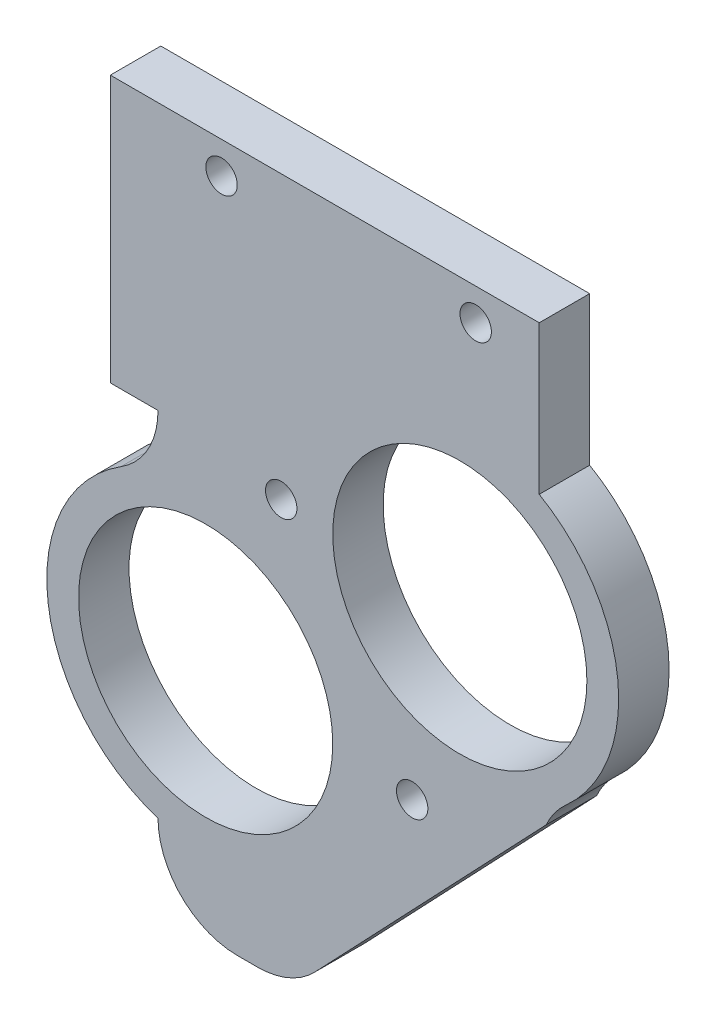
ISO-10303-21;
HEADER;
FILE_DESCRIPTION(('STEP AP214'),'2;1');
FILE_NAME('part.step','',(''),(''),'','','');
FILE_SCHEMA(('AUTOMOTIVE_DESIGN { 1 0 10303 214 1 1 1 1 }'));
ENDSEC;
DATA;
#1=APPLICATION_CONTEXT('core data for automotive mechanical design processes');
#2=APPLICATION_PROTOCOL_DEFINITION('international standard','automotive_design',2000,#1);
#3=PRODUCT_CONTEXT('',#1,'mechanical');
#4=PRODUCT('Part','Part','',(#3));
#5=PRODUCT_RELATED_PRODUCT_CATEGORY('part','',(#4));
#6=PRODUCT_DEFINITION_FORMATION('','',#4);
#7=PRODUCT_DEFINITION_CONTEXT('part definition',#1,'design');
#8=PRODUCT_DEFINITION('design','',#6,#7);
#9=PRODUCT_DEFINITION_SHAPE('','',#8);
#10=(LENGTH_UNIT() NAMED_UNIT(*) SI_UNIT(.MILLI.,.METRE.));
#11=(NAMED_UNIT(*) PLANE_ANGLE_UNIT() SI_UNIT($,.RADIAN.));
#12=(NAMED_UNIT(*) SI_UNIT($,.STERADIAN.) SOLID_ANGLE_UNIT());
#13=UNCERTAINTY_MEASURE_WITH_UNIT(LENGTH_MEASURE(1.E-05),#10,'distance_accuracy_value','');
#14=(GEOMETRIC_REPRESENTATION_CONTEXT(3) GLOBAL_UNCERTAINTY_ASSIGNED_CONTEXT((#13)) GLOBAL_UNIT_ASSIGNED_CONTEXT((#10,
#11,#12)) REPRESENTATION_CONTEXT('',''));
#15=CARTESIAN_POINT('',(0.,0.,0.));
#16=DIRECTION('',(0.,0.,1.));
#17=DIRECTION('',(1.,0.,0.));
#18=AXIS2_PLACEMENT_3D('',#15,#16,#17);
#19=CARTESIAN_POINT('',(29.9407204806582,31.5431624215841,6.35));
#20=DIRECTION('',(0.,0.,1.));
#21=DIRECTION('',(1.,0.,0.));
#22=AXIS2_PLACEMENT_3D('',#19,#20,#21);
#23=PLANE('',#22);
#24=CARTESIAN_POINT('',(-2.05927951934184,8.63316190959069,6.35));
#25=DIRECTION('',(0.,0.,1.));
#26=DIRECTION('',(1.,0.,0.));
#27=AXIS2_PLACEMENT_3D('',#24,#25,#26);
#28=CIRCLE('',#27,20.);
#29=CARTESIAN_POINT('',(-12.7259461860085,25.5512652968567,6.35));
#30=VERTEX_POINT('',#29);
#31=CARTESIAN_POINT('',(-8.05927951934187,-10.4456221187482,6.35));
#32=VERTEX_POINT('',#31);
#33=EDGE_CURVE('E169',#30,#32,#28,.T.);
#34=ORIENTED_EDGE('',*,*,#33,.T.);
#35=CARTESIAN_POINT('',(1.94070069324728,-10.4257287071368,6.35));
#36=DIRECTION('',(0.,0.,1.));
#37=DIRECTION('',(1.,0.,0.));
#38=AXIS2_PLACEMENT_3D('',#35,#36,#37);
#39=CIRCLE('',#38,10.);
#40=CARTESIAN_POINT('',(1.94070069324728,-20.4257287071368,6.35));
#41=VERTEX_POINT('',#40);
#42=EDGE_CURVE('E42',#32,#41,#39,.T.);
#43=ORIENTED_EDGE('',*,*,#42,.T.);
#44=DIRECTION('',(-1.,0.,0.));
#45=VECTOR('',#44,1.);
#46=CARTESIAN_POINT('',(-8.05927951934189,-20.4257287071368,6.35));
#47=LINE('',#46,#45);
#48=CARTESIAN_POINT('',(4.47625883225479,-20.4257287071368,6.35));
#49=VERTEX_POINT('',#48);
#50=EDGE_CURVE('E167',#49,#41,#47,.T.);
#51=ORIENTED_EDGE('',*,*,#50,.F.);
#52=CARTESIAN_POINT('',(4.47625883225479,-10.4257287071368,6.35));
#53=DIRECTION('',(0.,0.,1.));
#54=DIRECTION('',(1.,0.,0.));
#55=AXIS2_PLACEMENT_3D('',#52,#53,#54);
#56=CIRCLE('',#55,10.);
#57=CARTESIAN_POINT('',(11.7219358395692,-17.3177650321772,6.35000000000002));
#58=VERTEX_POINT('',#57);
#59=EDGE_CURVE('E49',#49,#58,#56,.T.);
#60=ORIENTED_EDGE('',*,*,#59,.T.);
#61=DIRECTION('',(0.689203632504033,0.72456770073144,0.));
#62=VECTOR('',#61,1.);
#63=CARTESIAN_POINT('',(40.8120111889054,13.2649655512249,6.35000000000002));
#64=LINE('',#63,#62);
#65=CARTESIAN_POINT('',(40.8120111889054,13.2649655512249,6.35000000000002));
#66=VERTEX_POINT('',#65);
#67=EDGE_CURVE('E121',#58,#66,#64,.T.);
#68=ORIENTED_EDGE('',*,*,#67,.T.);
#69=CARTESIAN_POINT('',(49.9407204806582,9.18248264658624,6.35));
#70=DIRECTION('',(0.,0.,1.));
#71=DIRECTION('',(1.,0.,0.));
#72=AXIS2_PLACEMENT_3D('',#69,#70,#71);
#73=CIRCLE('',#72,10.);
#74=CARTESIAN_POINT('',(43.2740538139915,16.6360425715855,6.35));
#75=VERTEX_POINT('',#74);
#76=EDGE_CURVE('E127',#66,#75,#73,.F.);
#77=ORIENTED_EDGE('',*,*,#76,.T.);
#78=CARTESIAN_POINT('',(29.9407204806582,31.5431624215841,6.35));
#79=DIRECTION('',(0.,0.,1.));
#80=DIRECTION('',(1.,0.,0.));
#81=AXIS2_PLACEMENT_3D('',#78,#79,#80);
#82=CIRCLE('',#81,20.);
#83=CARTESIAN_POINT('',(39.9407204806582,48.8636704972729,6.35));
#84=VERTEX_POINT('',#83);
#85=EDGE_CURVE('E201',#75,#84,#82,.T.);
#86=ORIENTED_EDGE('',*,*,#85,.T.);
#87=DIRECTION('',(0.,-1.,0.));
#88=VECTOR('',#87,1.);
#89=CARTESIAN_POINT('',(39.9407204806582,47.5742712928632,6.35));
#90=LINE('',#89,#88);
#91=CARTESIAN_POINT('',(39.9407204806582,67.5742712928632,6.35000000000002));
#92=VERTEX_POINT('',#91);
#93=EDGE_CURVE('E239',#92,#84,#90,.T.);
#94=ORIENTED_EDGE('',*,*,#93,.F.);
#95=DIRECTION('',(1.,0.,0.));
#96=VECTOR('',#95,1.);
#97=CARTESIAN_POINT('',(-8.05927951934186,67.5742712928632,6.35));
#98=LINE('',#97,#96);
#99=CARTESIAN_POINT('',(-14.0592795193419,67.5742712928632,6.35));
#100=VERTEX_POINT('',#99);
#101=EDGE_CURVE('E233',#100,#92,#98,.T.);
#102=ORIENTED_EDGE('',*,*,#101,.F.);
#103=DIRECTION('',(0.,1.,0.));
#104=VECTOR('',#103,1.);
#105=CARTESIAN_POINT('',(-14.0592795193419,67.5742712928632,6.35));
#106=LINE('',#105,#104);
#107=CARTESIAN_POINT('',(-14.0592795193419,34.0103169904897,6.35));
#108=VERTEX_POINT('',#107);
#109=EDGE_CURVE('E219',#108,#100,#106,.T.);
#110=ORIENTED_EDGE('',*,*,#109,.F.);
#111=DIRECTION('',(1.,0.,0.));
#112=VECTOR('',#111,1.);
#113=CARTESIAN_POINT('',(-14.0592795193419,34.0103169904897,6.35));
#114=LINE('',#113,#112);
#115=CARTESIAN_POINT('',(-8.05927951934186,34.0103169904897,6.35));
#116=VERTEX_POINT('',#115);
#117=EDGE_CURVE('E213',#108,#116,#114,.T.);
#118=ORIENTED_EDGE('',*,*,#117,.T.);
#119=CARTESIAN_POINT('',(-18.0592795193419,34.0103169904897,6.35));
#120=DIRECTION('',(0.,0.,1.));
#121=DIRECTION('',(1.,0.,0.));
#122=AXIS2_PLACEMENT_3D('',#119,#120,#121);
#123=CIRCLE('',#122,10.);
#124=EDGE_CURVE('E147',#116,#30,#123,.F.);
#125=ORIENTED_EDGE('',*,*,#124,.T.);
#126=EDGE_LOOP('',(#34,#43,#51,#60,#68,#77,#86,#94,#102,#110,#118,#125));
#127=FACE_BOUND('',#126,.T.);
#128=CARTESIAN_POINT('',(31.9407204806584,63.5742712928632,6.35));
#129=DIRECTION('',(0.,0.,1.));
#130=DIRECTION('',(1.,0.,0.));
#131=AXIS2_PLACEMENT_3D('',#128,#129,#130);
#132=CIRCLE('',#131,1.97631800523663);
#133=CARTESIAN_POINT('',(33.917038485895,63.5742712928632,6.35));
#134=VERTEX_POINT('',#133);
#135=EDGE_CURVE('E281',#134,#134,#132,.T.);
#136=ORIENTED_EDGE('',*,*,#135,.F.);
#137=EDGE_LOOP('',(#136));
#138=FACE_BOUND('',#137,.T.);
#139=CARTESIAN_POINT('',(7.45543910641975,32.0595526671018,6.35));
#140=DIRECTION('',(0.,0.,1.));
#141=DIRECTION('',(1.,0.,0.));
#142=AXIS2_PLACEMENT_3D('',#139,#140,#141);
#143=CIRCLE('',#142,1.97631800523663);
#144=CARTESIAN_POINT('',(9.43175711165638,32.0595526671018,6.35));
#145=VERTEX_POINT('',#144);
#146=EDGE_CURVE('E282',#145,#145,#143,.T.);
#147=ORIENTED_EDGE('',*,*,#146,.F.);
#148=EDGE_LOOP('',(#147));
#149=FACE_BOUND('',#148,.T.);
#150=CARTESIAN_POINT('',(23.9407204806583,7.57427129286317,6.35));
#151=DIRECTION('',(0.,0.,1.));
#152=DIRECTION('',(1.,0.,0.));
#153=AXIS2_PLACEMENT_3D('',#150,#151,#152);
#154=CIRCLE('',#153,1.97631800523663);
#155=CARTESIAN_POINT('',(25.917038485895,7.57427129286317,6.35));
#156=VERTEX_POINT('',#155);
#157=EDGE_CURVE('E268',#156,#156,#154,.T.);
#158=ORIENTED_EDGE('',*,*,#157,.F.);
#159=EDGE_LOOP('',(#158));
#160=FACE_BOUND('',#159,.T.);
#161=CARTESIAN_POINT('',(-0.0592795193416554,63.5742712928632,6.35));
#162=DIRECTION('',(0.,0.,1.));
#163=DIRECTION('',(1.,0.,0.));
#164=AXIS2_PLACEMENT_3D('',#161,#162,#163);
#165=CIRCLE('',#164,1.97631800523663);
#166=CARTESIAN_POINT('',(1.91703848589497,63.5742712928632,6.35));
#167=VERTEX_POINT('',#166);
#168=EDGE_CURVE('E275',#167,#167,#165,.T.);
#169=ORIENTED_EDGE('',*,*,#168,.F.);
#170=EDGE_LOOP('',(#169));
#171=FACE_BOUND('',#170,.T.);
#172=CARTESIAN_POINT('',(-2.05927951934184,8.63316190959069,6.35));
#173=DIRECTION('',(0.,0.,1.));
#174=DIRECTION('',(1.,0.,0.));
#175=AXIS2_PLACEMENT_3D('',#172,#173,#174);
#176=CIRCLE('',#175,15.9999999999977);
#177=CARTESIAN_POINT('',(13.9407204806558,8.63316190959069,6.35));
#178=VERTEX_POINT('',#177);
#179=EDGE_CURVE('E193',#178,#178,#176,.T.);
#180=ORIENTED_EDGE('',*,*,#179,.F.);
#181=EDGE_LOOP('',(#180));
#182=FACE_BOUND('',#181,.T.);
#183=CARTESIAN_POINT('',(29.9407204806582,31.5431624215841,6.35));
#184=DIRECTION('',(0.,0.,1.));
#185=DIRECTION('',(1.,0.,0.));
#186=AXIS2_PLACEMENT_3D('',#183,#184,#185);
#187=CIRCLE('',#186,15.9999999999975);
#188=CARTESIAN_POINT('',(45.9407204806557,31.5431624215841,6.35));
#189=VERTEX_POINT('',#188);
#190=EDGE_CURVE('E243',#189,#189,#187,.T.);
#191=ORIENTED_EDGE('',*,*,#190,.F.);
#192=EDGE_LOOP('',(#191));
#193=FACE_BOUND('',#192,.T.);
#194=ADVANCED_FACE('F34',(#127,#138,#149,#160,#171,#182,#193),#23,.T.);
#195=CARTESIAN_POINT('',(29.9407204806582,31.5431624215841,0.));
#196=DIRECTION('',(0.,0.,1.));
#197=DIRECTION('',(1.,0.,0.));
#198=AXIS2_PLACEMENT_3D('',#195,#196,#197);
#199=PLANE('',#198);
#200=CARTESIAN_POINT('',(31.9407204806584,63.5742712928632,0.));
#201=DIRECTION('',(0.,0.,1.));
#202=DIRECTION('',(1.,0.,0.));
#203=AXIS2_PLACEMENT_3D('',#200,#201,#202);
#204=CIRCLE('',#203,1.97631800523663);
#205=CARTESIAN_POINT('',(33.917038485895,63.5742712928632,0.));
#206=VERTEX_POINT('',#205);
#207=EDGE_CURVE('E265',#206,#206,#204,.T.);
#208=ORIENTED_EDGE('',*,*,#207,.T.);
#209=EDGE_LOOP('',(#208));
#210=FACE_BOUND('',#209,.T.);
#211=CARTESIAN_POINT('',(7.45543910641975,32.0595526671018,0.));
#212=DIRECTION('',(0.,0.,1.));
#213=DIRECTION('',(1.,0.,0.));
#214=AXIS2_PLACEMENT_3D('',#211,#212,#213);
#215=CIRCLE('',#214,1.97631800523663);
#216=CARTESIAN_POINT('',(9.43175711165638,32.0595526671018,0.));
#217=VERTEX_POINT('',#216);
#218=EDGE_CURVE('E272',#217,#217,#215,.T.);
#219=ORIENTED_EDGE('',*,*,#218,.T.);
#220=EDGE_LOOP('',(#219));
#221=FACE_BOUND('',#220,.T.);
#222=CARTESIAN_POINT('',(23.9407204806583,7.57427129286317,0.));
#223=DIRECTION('',(0.,0.,1.));
#224=DIRECTION('',(1.,0.,0.));
#225=AXIS2_PLACEMENT_3D('',#222,#223,#224);
#226=CIRCLE('',#225,1.97631800523663);
#227=CARTESIAN_POINT('',(25.917038485895,7.57427129286317,0.));
#228=VERTEX_POINT('',#227);
#229=EDGE_CURVE('E271',#228,#228,#226,.T.);
#230=ORIENTED_EDGE('',*,*,#229,.T.);
#231=EDGE_LOOP('',(#230));
#232=FACE_BOUND('',#231,.T.);
#233=CARTESIAN_POINT('',(-0.0592795193416554,63.5742712928632,0.));
#234=DIRECTION('',(0.,0.,1.));
#235=DIRECTION('',(1.,0.,0.));
#236=AXIS2_PLACEMENT_3D('',#233,#234,#235);
#237=CIRCLE('',#236,1.97631800523663);
#238=CARTESIAN_POINT('',(1.91703848589497,63.5742712928632,0.));
#239=VERTEX_POINT('',#238);
#240=EDGE_CURVE('E278',#239,#239,#237,.T.);
#241=ORIENTED_EDGE('',*,*,#240,.T.);
#242=EDGE_LOOP('',(#241));
#243=FACE_BOUND('',#242,.T.);
#244=DIRECTION('',(-1.,0.,0.));
#245=VECTOR('',#244,1.);
#246=CARTESIAN_POINT('',(-8.05927951934189,-20.4257287071368,0.));
#247=LINE('',#246,#245);
#248=CARTESIAN_POINT('',(4.47625883225479,-20.4257287071368,0.));
#249=VERTEX_POINT('',#248);
#250=CARTESIAN_POINT('',(1.94070069324728,-20.4257287071368,0.));
#251=VERTEX_POINT('',#250);
#252=EDGE_CURVE('E178',#249,#251,#247,.T.);
#253=ORIENTED_EDGE('',*,*,#252,.T.);
#254=CARTESIAN_POINT('',(1.94070069324728,-10.4257287071368,0.));
#255=DIRECTION('',(0.,0.,1.));
#256=DIRECTION('',(1.,0.,0.));
#257=AXIS2_PLACEMENT_3D('',#254,#255,#256);
#258=CIRCLE('',#257,10.);
#259=CARTESIAN_POINT('',(-8.05927951934187,-10.4456221187482,0.));
#260=VERTEX_POINT('',#259);
#261=EDGE_CURVE('E163',#251,#260,#258,.F.);
#262=ORIENTED_EDGE('',*,*,#261,.T.);
#263=CARTESIAN_POINT('',(-2.05927951934184,8.63316190959069,0.));
#264=DIRECTION('',(0.,0.,1.));
#265=DIRECTION('',(1.,0.,0.));
#266=AXIS2_PLACEMENT_3D('',#263,#264,#265);
#267=CIRCLE('',#266,20.);
#268=CARTESIAN_POINT('',(-12.7259461860085,25.5512652968567,0.));
#269=VERTEX_POINT('',#268);
#270=EDGE_CURVE('E186',#269,#260,#267,.T.);
#271=ORIENTED_EDGE('',*,*,#270,.F.);
#272=CARTESIAN_POINT('',(-18.0592795193419,34.0103169904897,0.));
#273=DIRECTION('',(0.,0.,1.));
#274=DIRECTION('',(1.,0.,0.));
#275=AXIS2_PLACEMENT_3D('',#272,#273,#274);
#276=CIRCLE('',#275,10.);
#277=CARTESIAN_POINT('',(-8.05927951934186,34.0103169904897,0.));
#278=VERTEX_POINT('',#277);
#279=EDGE_CURVE('E144',#269,#278,#276,.T.);
#280=ORIENTED_EDGE('',*,*,#279,.T.);
#281=DIRECTION('',(1.,0.,0.));
#282=VECTOR('',#281,1.);
#283=CARTESIAN_POINT('',(-14.0592795193419,34.0103169904897,0.));
#284=LINE('',#283,#282);
#285=CARTESIAN_POINT('',(-14.0592795193419,34.0103169904897,0.));
#286=VERTEX_POINT('',#285);
#287=EDGE_CURVE('E216',#286,#278,#284,.T.);
#288=ORIENTED_EDGE('',*,*,#287,.F.);
#289=DIRECTION('',(0.,-1.,0.));
#290=VECTOR('',#289,1.);
#291=CARTESIAN_POINT('',(-14.0592795193419,67.5742712928632,0.));
#292=LINE('',#291,#290);
#293=CARTESIAN_POINT('',(-14.0592795193419,67.5742712928632,0.));
#294=VERTEX_POINT('',#293);
#295=EDGE_CURVE('E223',#294,#286,#292,.T.);
#296=ORIENTED_EDGE('',*,*,#295,.F.);
#297=DIRECTION('',(1.,0.,0.));
#298=VECTOR('',#297,1.);
#299=CARTESIAN_POINT('',(-8.05927951934186,67.5742712928632,0.));
#300=LINE('',#299,#298);
#301=CARTESIAN_POINT('',(39.9407204806582,67.5742712928632,0.));
#302=VERTEX_POINT('',#301);
#303=EDGE_CURVE('E229',#294,#302,#300,.T.);
#304=ORIENTED_EDGE('',*,*,#303,.T.);
#305=DIRECTION('',(0.,-1.,0.));
#306=VECTOR('',#305,1.);
#307=CARTESIAN_POINT('',(39.9407204806582,47.5742712928632,0.));
#308=LINE('',#307,#306);
#309=CARTESIAN_POINT('',(39.9407204806582,48.8636704972729,0.));
#310=VERTEX_POINT('',#309);
#311=EDGE_CURVE('E230',#302,#310,#308,.T.);
#312=ORIENTED_EDGE('',*,*,#311,.T.);
#313=CARTESIAN_POINT('',(29.9407204806582,31.5431624215841,0.));
#314=DIRECTION('',(0.,0.,1.));
#315=DIRECTION('',(1.,0.,0.));
#316=AXIS2_PLACEMENT_3D('',#313,#314,#315);
#317=CIRCLE('',#316,20.);
#318=CARTESIAN_POINT('',(43.2740538139915,16.6360425715855,0.));
#319=VERTEX_POINT('',#318);
#320=EDGE_CURVE('E192',#319,#310,#317,.T.);
#321=ORIENTED_EDGE('',*,*,#320,.F.);
#322=CARTESIAN_POINT('',(49.9407204806582,9.18248264658624,0.));
#323=DIRECTION('',(0.,0.,1.));
#324=DIRECTION('',(1.,0.,0.));
#325=AXIS2_PLACEMENT_3D('',#322,#323,#324);
#326=CIRCLE('',#325,10.);
#327=CARTESIAN_POINT('',(40.8120111889054,13.2649655512249,0.));
#328=VERTEX_POINT('',#327);
#329=EDGE_CURVE('E145',#319,#328,#326,.T.);
#330=ORIENTED_EDGE('',*,*,#329,.T.);
#331=DIRECTION('',(0.689203632504033,0.72456770073144,0.));
#332=VECTOR('',#331,1.);
#333=CARTESIAN_POINT('',(40.8120111889054,13.2649655512249,0.));
#334=LINE('',#333,#332);
#335=CARTESIAN_POINT('',(11.7219358395692,-17.3177650321772,0.));
#336=VERTEX_POINT('',#335);
#337=EDGE_CURVE('E131',#336,#328,#334,.T.);
#338=ORIENTED_EDGE('',*,*,#337,.F.);
#339=CARTESIAN_POINT('',(4.47625883225479,-10.4257287071368,0.));
#340=DIRECTION('',(0.,0.,1.));
#341=DIRECTION('',(1.,0.,0.));
#342=AXIS2_PLACEMENT_3D('',#339,#340,#341);
#343=CIRCLE('',#342,10.);
#344=EDGE_CURVE('E57',#336,#249,#343,.F.);
#345=ORIENTED_EDGE('',*,*,#344,.T.);
#346=EDGE_LOOP('',(#253,#262,#271,#280,#288,#296,#304,#312,#321,#330,#338,#345));
#347=FACE_BOUND('',#346,.T.);
#348=CARTESIAN_POINT('',(-2.05927951934184,8.63316190959069,0.));
#349=DIRECTION('',(0.,0.,1.));
#350=DIRECTION('',(1.,0.,0.));
#351=AXIS2_PLACEMENT_3D('',#348,#349,#350);
#352=CIRCLE('',#351,15.9999999999977);
#353=CARTESIAN_POINT('',(13.9407204806558,8.63316190959069,0.));
#354=VERTEX_POINT('',#353);
#355=EDGE_CURVE('E198',#354,#354,#352,.T.);
#356=ORIENTED_EDGE('',*,*,#355,.T.);
#357=EDGE_LOOP('',(#356));
#358=FACE_BOUND('',#357,.T.);
#359=CARTESIAN_POINT('',(29.9407204806582,31.5431624215841,0.));
#360=DIRECTION('',(0.,0.,1.));
#361=DIRECTION('',(1.,0.,0.));
#362=AXIS2_PLACEMENT_3D('',#359,#360,#361);
#363=CIRCLE('',#362,15.9999999999975);
#364=CARTESIAN_POINT('',(45.9407204806557,31.5431624215841,0.));
#365=VERTEX_POINT('',#364);
#366=EDGE_CURVE('E241',#365,#365,#363,.T.);
#367=ORIENTED_EDGE('',*,*,#366,.T.);
#368=EDGE_LOOP('',(#367));
#369=FACE_BOUND('',#368,.T.);
#370=ADVANCED_FACE('F184',(#210,#221,#232,#243,#347,#358,#369),#199,.F.);
#371=CARTESIAN_POINT('',(-2.05927951934184,8.63316190959069,6.35));
#372=DIRECTION('',(0.,0.,-1.));
#373=DIRECTION('',(-1.,0.,0.));
#374=AXIS2_PLACEMENT_3D('',#371,#372,#373);
#375=CYLINDRICAL_SURFACE('',#374,20.);
#376=ORIENTED_EDGE('',*,*,#270,.T.);
#377=DIRECTION('',(0.,0.,-1.));
#378=VECTOR('',#377,1.);
#379=CARTESIAN_POINT('',(-8.05927951934186,-10.4456221187482,6.35));
#380=LINE('',#379,#378);
#381=EDGE_CURVE('E177',#260,#32,#380,.F.);
#382=ORIENTED_EDGE('',*,*,#381,.T.);
#383=ORIENTED_EDGE('',*,*,#33,.F.);
#384=DIRECTION('',(0.,0.,-1.));
#385=VECTOR('',#384,1.);
#386=CARTESIAN_POINT('',(-12.7259461860085,25.5512652968567,6.35));
#387=LINE('',#386,#385);
#388=EDGE_CURVE('E191',#30,#269,#387,.T.);
#389=ORIENTED_EDGE('',*,*,#388,.T.);
#390=EDGE_LOOP('',(#376,#382,#383,#389));
#391=FACE_BOUND('',#390,.T.);
#392=ADVANCED_FACE('F189',(#391),#375,.T.);
#393=CARTESIAN_POINT('',(29.9407204806582,31.5431624215841,6.35));
#394=DIRECTION('',(0.,0.,-1.));
#395=DIRECTION('',(-1.,0.,0.));
#396=AXIS2_PLACEMENT_3D('',#393,#394,#395);
#397=CYLINDRICAL_SURFACE('',#396,20.);
#398=ORIENTED_EDGE('',*,*,#320,.T.);
#399=DIRECTION('',(0.,0.,-1.));
#400=VECTOR('',#399,1.);
#401=CARTESIAN_POINT('',(39.9407204806582,48.8636704972729,6.35));
#402=LINE('',#401,#400);
#403=EDGE_CURVE('E154',#310,#84,#402,.F.);
#404=ORIENTED_EDGE('',*,*,#403,.T.);
#405=ORIENTED_EDGE('',*,*,#85,.F.);
#406=DIRECTION('',(0.,0.,-1.));
#407=VECTOR('',#406,1.);
#408=CARTESIAN_POINT('',(43.2740538139915,16.6360425715855,6.35));
#409=LINE('',#408,#407);
#410=EDGE_CURVE('E143',#75,#319,#409,.T.);
#411=ORIENTED_EDGE('',*,*,#410,.T.);
#412=EDGE_LOOP('',(#398,#404,#405,#411));
#413=FACE_BOUND('',#412,.T.);
#414=ADVANCED_FACE('F251',(#413),#397,.T.);
#415=CARTESIAN_POINT('',(-2.05927951934184,8.63316190959069,6.35));
#416=DIRECTION('',(0.,0.,-1.));
#417=DIRECTION('',(-1.,0.,0.));
#418=AXIS2_PLACEMENT_3D('',#415,#416,#417);
#419=CYLINDRICAL_SURFACE('',#418,15.9999999999977);
#420=ORIENTED_EDGE('',*,*,#179,.T.);
#421=EDGE_LOOP('',(#420));
#422=FACE_BOUND('',#421,.T.);
#423=ORIENTED_EDGE('',*,*,#355,.F.);
#424=EDGE_LOOP('',(#423));
#425=FACE_BOUND('',#424,.T.);
#426=ADVANCED_FACE('F352',(#422,#425),#419,.F.);
#427=CARTESIAN_POINT('',(29.9407204806582,31.5431624215841,6.35));
#428=DIRECTION('',(0.,0.,-1.));
#429=DIRECTION('',(-1.,0.,0.));
#430=AXIS2_PLACEMENT_3D('',#427,#428,#429);
#431=CYLINDRICAL_SURFACE('',#430,15.9999999999975);
#432=ORIENTED_EDGE('',*,*,#190,.T.);
#433=EDGE_LOOP('',(#432));
#434=FACE_BOUND('',#433,.T.);
#435=ORIENTED_EDGE('',*,*,#366,.F.);
#436=EDGE_LOOP('',(#435));
#437=FACE_BOUND('',#436,.T.);
#438=ADVANCED_FACE('F362',(#434,#437),#431,.F.);
#439=CARTESIAN_POINT('',(49.9407204806582,9.18248264658624,6.35));
#440=DIRECTION('',(0.,0.,-1.));
#441=DIRECTION('',(-1.,0.,0.));
#442=AXIS2_PLACEMENT_3D('',#439,#440,#441);
#443=CYLINDRICAL_SURFACE('',#442,10.);
#444=ORIENTED_EDGE('',*,*,#76,.F.);
#445=DIRECTION('',(0.,0.,-1.));
#446=VECTOR('',#445,1.);
#447=CARTESIAN_POINT('',(40.8120111889054,13.2649655512249,6.35000000000002));
#448=LINE('',#447,#446);
#449=EDGE_CURVE('E130',#66,#328,#448,.T.);
#450=ORIENTED_EDGE('',*,*,#449,.T.);
#451=ORIENTED_EDGE('',*,*,#329,.F.);
#452=ORIENTED_EDGE('',*,*,#410,.F.);
#453=EDGE_LOOP('',(#444,#450,#451,#452));
#454=FACE_BOUND('',#453,.T.);
#455=ADVANCED_FACE('F141',(#454),#443,.F.);
#456=CARTESIAN_POINT('',(-18.0592795193419,34.0103169904897,6.35));
#457=DIRECTION('',(0.,0.,-1.));
#458=DIRECTION('',(-1.,0.,0.));
#459=AXIS2_PLACEMENT_3D('',#456,#457,#458);
#460=CYLINDRICAL_SURFACE('',#459,10.);
#461=ORIENTED_EDGE('',*,*,#124,.F.);
#462=DIRECTION('',(0.,0.,1.));
#463=VECTOR('',#462,1.);
#464=CARTESIAN_POINT('',(-8.05927951934186,34.0103169904897,6.35));
#465=LINE('',#464,#463);
#466=EDGE_CURVE('E149',#278,#116,#465,.T.);
#467=ORIENTED_EDGE('',*,*,#466,.F.);
#468=ORIENTED_EDGE('',*,*,#279,.F.);
#469=ORIENTED_EDGE('',*,*,#388,.F.);
#470=EDGE_LOOP('',(#461,#467,#468,#469));
#471=FACE_BOUND('',#470,.T.);
#472=ADVANCED_FACE('F361',(#471),#460,.F.);
#473=CARTESIAN_POINT('',(39.9407204806582,47.5742712928632,58.3500000000001));
#474=DIRECTION('',(1.,0.,0.));
#475=DIRECTION('',(0.,1.,0.));
#476=AXIS2_PLACEMENT_3D('',#473,#474,#475);
#477=PLANE('',#476);
#478=ORIENTED_EDGE('',*,*,#403,.F.);
#479=ORIENTED_EDGE('',*,*,#311,.F.);
#480=DIRECTION('',(0.,0.,-1.));
#481=VECTOR('',#480,1.);
#482=CARTESIAN_POINT('',(39.9407204806582,67.5742712928632,58.3500000000001));
#483=LINE('',#482,#481);
#484=EDGE_CURVE('E238',#92,#302,#483,.T.);
#485=ORIENTED_EDGE('',*,*,#484,.F.);
#486=ORIENTED_EDGE('',*,*,#93,.T.);
#487=EDGE_LOOP('',(#478,#479,#485,#486));
#488=FACE_BOUND('',#487,.T.);
#489=ADVANCED_FACE('F255',(#488),#477,.T.);
#490=CARTESIAN_POINT('',(-8.05927951934186,67.5742712928632,58.3500000000001));
#491=DIRECTION('',(0.,1.,0.));
#492=DIRECTION('',(0.,0.,1.));
#493=AXIS2_PLACEMENT_3D('',#490,#491,#492);
#494=PLANE('',#493);
#495=ORIENTED_EDGE('',*,*,#303,.F.);
#496=DIRECTION('',(0.,0.,-1.));
#497=VECTOR('',#496,1.);
#498=CARTESIAN_POINT('',(-14.0592795193419,67.5742712928632,6.35));
#499=LINE('',#498,#497);
#500=EDGE_CURVE('E261',#100,#294,#499,.T.);
#501=ORIENTED_EDGE('',*,*,#500,.F.);
#502=ORIENTED_EDGE('',*,*,#101,.T.);
#503=ORIENTED_EDGE('',*,*,#484,.T.);
#504=EDGE_LOOP('',(#495,#501,#502,#503));
#505=FACE_BOUND('',#504,.T.);
#506=ADVANCED_FACE('F260',(#505),#494,.T.);
#507=CARTESIAN_POINT('',(-8.05927951934189,-20.4257287071368,58.3500000000001));
#508=DIRECTION('',(0.,-1.,0.));
#509=DIRECTION('',(1.,0.,0.));
#510=AXIS2_PLACEMENT_3D('',#507,#508,#509);
#511=PLANE('',#510);
#512=ORIENTED_EDGE('',*,*,#50,.T.);
#513=DIRECTION('',(0.,0.,1.));
#514=VECTOR('',#513,1.);
#515=CARTESIAN_POINT('',(1.94070069324728,-20.4257287071368,0.));
#516=LINE('',#515,#514);
#517=EDGE_CURVE('E159',#41,#251,#516,.F.);
#518=ORIENTED_EDGE('',*,*,#517,.T.);
#519=ORIENTED_EDGE('',*,*,#252,.F.);
#520=DIRECTION('',(0.,0.,-1.));
#521=VECTOR('',#520,1.);
#522=CARTESIAN_POINT('',(4.47625883225479,-20.4257287071368,6.35));
#523=LINE('',#522,#521);
#524=EDGE_CURVE('E157',#249,#49,#523,.F.);
#525=ORIENTED_EDGE('',*,*,#524,.T.);
#526=EDGE_LOOP('',(#512,#518,#519,#525));
#527=FACE_BOUND('',#526,.T.);
#528=ADVANCED_FACE('F174',(#527),#511,.T.);
#529=CARTESIAN_POINT('',(-14.0592795193419,34.0103169904897,6.35));
#530=DIRECTION('',(0.,1.,0.));
#531=DIRECTION('',(-1.,0.,0.));
#532=AXIS2_PLACEMENT_3D('',#529,#530,#531);
#533=PLANE('',#532);
#534=ORIENTED_EDGE('',*,*,#466,.T.);
#535=ORIENTED_EDGE('',*,*,#117,.F.);
#536=DIRECTION('',(0.,0.,1.));
#537=VECTOR('',#536,1.);
#538=CARTESIAN_POINT('',(-14.0592795193419,34.0103169904897,6.35));
#539=LINE('',#538,#537);
#540=EDGE_CURVE('E220',#286,#108,#539,.T.);
#541=ORIENTED_EDGE('',*,*,#540,.F.);
#542=ORIENTED_EDGE('',*,*,#287,.T.);
#543=EDGE_LOOP('',(#534,#535,#541,#542));
#544=FACE_BOUND('',#543,.T.);
#545=ADVANCED_FACE('F211',(#544),#533,.F.);
#546=CARTESIAN_POINT('',(-14.0592795193419,0.,0.));
#547=DIRECTION('',(1.,0.,0.));
#548=DIRECTION('',(0.,1.,0.));
#549=AXIS2_PLACEMENT_3D('',#546,#547,#548);
#550=PLANE('',#549);
#551=CARTESIAN_POINT('',(-14.0592795193419,62.5612121401388,2.74784194223843));
#552=DIRECTION('',(-1.,0.,0.));
#553=DIRECTION('',(0.,-1.,0.));
#554=AXIS2_PLACEMENT_3D('',#551,#552,#553);
#555=CIRCLE('',#554,0.818763352539889);
#556=CARTESIAN_POINT('',(-14.0592795193419,61.7424487875989,2.74784194223843));
#557=VERTEX_POINT('',#556);
#558=EDGE_CURVE('E303',#557,#557,#555,.T.);
#559=ORIENTED_EDGE('',*,*,#558,.F.);
#560=EDGE_LOOP('',(#559));
#561=FACE_BOUND('',#560,.T.);
#562=CARTESIAN_POINT('',(-14.0592795193419,51.3138321167249,2.75675658905308));
#563=DIRECTION('',(-1.,0.,0.));
#564=DIRECTION('',(0.,-1.,0.));
#565=AXIS2_PLACEMENT_3D('',#562,#563,#564);
#566=CIRCLE('',#565,0.818763352539888);
#567=CARTESIAN_POINT('',(-14.0592795193419,50.495068764185,2.75675658905308));
#568=VERTEX_POINT('',#567);
#569=EDGE_CURVE('E297',#568,#568,#566,.T.);
#570=ORIENTED_EDGE('',*,*,#569,.F.);
#571=EDGE_LOOP('',(#570));
#572=FACE_BOUND('',#571,.T.);
#573=CARTESIAN_POINT('',(-14.0592795193419,40.3138321167249,2.75675658905308));
#574=DIRECTION('',(-1.,0.,0.));
#575=DIRECTION('',(0.,-1.,0.));
#576=AXIS2_PLACEMENT_3D('',#573,#574,#575);
#577=CIRCLE('',#576,0.818763352539888);
#578=CARTESIAN_POINT('',(-14.0592795193419,39.495068764185,2.75675658905308));
#579=VERTEX_POINT('',#578);
#580=EDGE_CURVE('E138',#579,#579,#577,.T.);
#581=ORIENTED_EDGE('',*,*,#580,.F.);
#582=EDGE_LOOP('',(#581));
#583=FACE_BOUND('',#582,.T.);
#584=ORIENTED_EDGE('',*,*,#109,.T.);
#585=ORIENTED_EDGE('',*,*,#500,.T.);
#586=ORIENTED_EDGE('',*,*,#295,.T.);
#587=ORIENTED_EDGE('',*,*,#540,.T.);
#588=EDGE_LOOP('',(#584,#585,#586,#587));
#589=FACE_BOUND('',#588,.T.);
#590=ADVANCED_FACE('F263',(#561,#572,#583,#589),#550,.F.);
#591=CARTESIAN_POINT('',(-0.0592795193416554,63.5742712928632,0.));
#592=DIRECTION('',(0.,0.,1.));
#593=DIRECTION('',(1.,0.,0.));
#594=AXIS2_PLACEMENT_3D('',#591,#592,#593);
#595=CYLINDRICAL_SURFACE('',#594,1.97631800523663);
#596=ORIENTED_EDGE('',*,*,#240,.F.);
#597=EDGE_LOOP('',(#596));
#598=FACE_BOUND('',#597,.T.);
#599=ORIENTED_EDGE('',*,*,#168,.T.);
#600=EDGE_LOOP('',(#599));
#601=FACE_BOUND('',#600,.T.);
#602=ADVANCED_FACE('F321',(#598,#601),#595,.F.);
#603=CARTESIAN_POINT('',(23.9407204806583,7.57427129286317,0.));
#604=DIRECTION('',(0.,0.,1.));
#605=DIRECTION('',(1.,0.,0.));
#606=AXIS2_PLACEMENT_3D('',#603,#604,#605);
#607=CYLINDRICAL_SURFACE('',#606,1.97631800523663);
#608=ORIENTED_EDGE('',*,*,#229,.F.);
#609=EDGE_LOOP('',(#608));
#610=FACE_BOUND('',#609,.T.);
#611=ORIENTED_EDGE('',*,*,#157,.T.);
#612=EDGE_LOOP('',(#611));
#613=FACE_BOUND('',#612,.T.);
#614=ADVANCED_FACE('F474',(#610,#613),#607,.F.);
#615=CARTESIAN_POINT('',(7.45543910641975,32.0595526671018,0.));
#616=DIRECTION('',(0.,0.,1.));
#617=DIRECTION('',(1.,0.,0.));
#618=AXIS2_PLACEMENT_3D('',#615,#616,#617);
#619=CYLINDRICAL_SURFACE('',#618,1.97631800523663);
#620=ORIENTED_EDGE('',*,*,#218,.F.);
#621=EDGE_LOOP('',(#620));
#622=FACE_BOUND('',#621,.T.);
#623=ORIENTED_EDGE('',*,*,#146,.T.);
#624=EDGE_LOOP('',(#623));
#625=FACE_BOUND('',#624,.T.);
#626=ADVANCED_FACE('F340',(#622,#625),#619,.F.);
#627=CARTESIAN_POINT('',(31.9407204806584,63.5742712928632,0.));
#628=DIRECTION('',(0.,0.,1.));
#629=DIRECTION('',(1.,0.,0.));
#630=AXIS2_PLACEMENT_3D('',#627,#628,#629);
#631=CYLINDRICAL_SURFACE('',#630,1.97631800523663);
#632=ORIENTED_EDGE('',*,*,#207,.F.);
#633=EDGE_LOOP('',(#632));
#634=FACE_BOUND('',#633,.T.);
#635=ORIENTED_EDGE('',*,*,#135,.T.);
#636=EDGE_LOOP('',(#635));
#637=FACE_BOUND('',#636,.T.);
#638=ADVANCED_FACE('F330',(#634,#637),#631,.F.);
#639=CARTESIAN_POINT('',(-10.0592795193419,40.3138321167249,2.75675658905308));
#640=DIRECTION('',(-1.,0.,0.));
#641=DIRECTION('',(0.,-1.,0.));
#642=AXIS2_PLACEMENT_3D('',#639,#640,#641);
#643=CYLINDRICAL_SURFACE('',#642,0.818763352539888);
#644=CARTESIAN_POINT('',(-10.0592795193419,40.3138321167249,2.75675658905308));
#645=DIRECTION('',(-1.,0.,0.));
#646=DIRECTION('',(0.,-1.,0.));
#647=AXIS2_PLACEMENT_3D('',#644,#645,#646);
#648=CIRCLE('',#647,0.818763352539888);
#649=CARTESIAN_POINT('',(-10.0592795193419,39.495068764185,2.75675658905308));
#650=VERTEX_POINT('',#649);
#651=EDGE_CURVE('E294',#650,#650,#648,.T.);
#652=ORIENTED_EDGE('',*,*,#651,.F.);
#653=EDGE_LOOP('',(#652));
#654=FACE_BOUND('',#653,.T.);
#655=ORIENTED_EDGE('',*,*,#580,.T.);
#656=EDGE_LOOP('',(#655));
#657=FACE_BOUND('',#656,.T.);
#658=ADVANCED_FACE('F327',(#654,#657),#643,.F.);
#659=CARTESIAN_POINT('',(-10.0592795193419,40.3138321167249,2.75675658905308));
#660=DIRECTION('',(-1.,0.,0.));
#661=DIRECTION('',(0.,-1.,0.));
#662=AXIS2_PLACEMENT_3D('',#659,#660,#661);
#663=PLANE('',#662);
#664=ORIENTED_EDGE('',*,*,#651,.T.);
#665=EDGE_LOOP('',(#664));
#666=FACE_BOUND('',#665,.T.);
#667=ADVANCED_FACE('F329',(#666),#663,.T.);
#668=CARTESIAN_POINT('',(-10.0592795193419,51.3138321167249,2.75675658905308));
#669=DIRECTION('',(-1.,0.,0.));
#670=DIRECTION('',(0.,-1.,0.));
#671=AXIS2_PLACEMENT_3D('',#668,#669,#670);
#672=CYLINDRICAL_SURFACE('',#671,0.818763352539888);
#673=CARTESIAN_POINT('',(-10.0592795193419,51.3138321167249,2.75675658905308));
#674=DIRECTION('',(-1.,0.,0.));
#675=DIRECTION('',(0.,-1.,0.));
#676=AXIS2_PLACEMENT_3D('',#673,#674,#675);
#677=CIRCLE('',#676,0.818763352539888);
#678=CARTESIAN_POINT('',(-10.0592795193419,50.495068764185,2.75675658905308));
#679=VERTEX_POINT('',#678);
#680=EDGE_CURVE('E300',#679,#679,#677,.T.);
#681=ORIENTED_EDGE('',*,*,#680,.F.);
#682=EDGE_LOOP('',(#681));
#683=FACE_BOUND('',#682,.T.);
#684=ORIENTED_EDGE('',*,*,#569,.T.);
#685=EDGE_LOOP('',(#684));
#686=FACE_BOUND('',#685,.T.);
#687=ADVANCED_FACE('F337',(#683,#686),#672,.F.);
#688=CARTESIAN_POINT('',(-10.0592795193419,51.3138321167249,2.75675658905308));
#689=DIRECTION('',(-1.,0.,0.));
#690=DIRECTION('',(0.,-1.,0.));
#691=AXIS2_PLACEMENT_3D('',#688,#689,#690);
#692=PLANE('',#691);
#693=ORIENTED_EDGE('',*,*,#680,.T.);
#694=EDGE_LOOP('',(#693));
#695=FACE_BOUND('',#694,.T.);
#696=ADVANCED_FACE('F315',(#695),#692,.T.);
#697=CARTESIAN_POINT('',(-10.0592795193419,62.5612121401388,2.74784194223843));
#698=DIRECTION('',(-1.,0.,0.));
#699=DIRECTION('',(0.,-1.,0.));
#700=AXIS2_PLACEMENT_3D('',#697,#698,#699);
#701=CYLINDRICAL_SURFACE('',#700,0.818763352539889);
#702=CARTESIAN_POINT('',(-10.0592795193419,62.5612121401388,2.74784194223843));
#703=DIRECTION('',(-1.,0.,0.));
#704=DIRECTION('',(0.,-1.,0.));
#705=AXIS2_PLACEMENT_3D('',#702,#703,#704);
#706=CIRCLE('',#705,0.818763352539889);
#707=CARTESIAN_POINT('',(-10.0592795193419,61.7424487875989,2.74784194223843));
#708=VERTEX_POINT('',#707);
#709=EDGE_CURVE('E285',#708,#708,#706,.T.);
#710=ORIENTED_EDGE('',*,*,#709,.F.);
#711=EDGE_LOOP('',(#710));
#712=FACE_BOUND('',#711,.T.);
#713=ORIENTED_EDGE('',*,*,#558,.T.);
#714=EDGE_LOOP('',(#713));
#715=FACE_BOUND('',#714,.T.);
#716=ADVANCED_FACE('F312',(#712,#715),#701,.F.);
#717=CARTESIAN_POINT('',(-10.0592795193419,62.5612121401388,2.74784194223843));
#718=DIRECTION('',(-1.,0.,0.));
#719=DIRECTION('',(0.,-1.,0.));
#720=AXIS2_PLACEMENT_3D('',#717,#718,#719);
#721=PLANE('',#720);
#722=ORIENTED_EDGE('',*,*,#709,.T.);
#723=EDGE_LOOP('',(#722));
#724=FACE_BOUND('',#723,.T.);
#725=ADVANCED_FACE('F310',(#724),#721,.T.);
#726=CARTESIAN_POINT('',(40.8120111889054,13.2649655512249,6.35000000000002));
#727=DIRECTION('',(-0.72456770073144,0.689203632504033,0.));
#728=DIRECTION('',(-0.689203632504033,-0.72456770073144,0.));
#729=AXIS2_PLACEMENT_3D('',#726,#727,#728);
#730=PLANE('',#729);
#731=ORIENTED_EDGE('',*,*,#67,.F.);
#732=DIRECTION('',(0.,0.,-1.));
#733=VECTOR('',#732,1.);
#734=CARTESIAN_POINT('',(11.7219358395692,-17.3177650321772,0.));
#735=LINE('',#734,#733);
#736=EDGE_CURVE('E11',#58,#336,#735,.T.);
#737=ORIENTED_EDGE('',*,*,#736,.T.);
#738=ORIENTED_EDGE('',*,*,#337,.T.);
#739=ORIENTED_EDGE('',*,*,#449,.F.);
#740=EDGE_LOOP('',(#731,#737,#738,#739));
#741=FACE_BOUND('',#740,.T.);
#742=ADVANCED_FACE('F134',(#741),#730,.F.);
#743=CARTESIAN_POINT('',(1.94070069324728,-10.4257287071368,6.35));
#744=DIRECTION('',(0.,0.,-1.));
#745=DIRECTION('',(-1.,0.,0.));
#746=AXIS2_PLACEMENT_3D('',#743,#744,#745);
#747=CYLINDRICAL_SURFACE('',#746,10.);
#748=ORIENTED_EDGE('',*,*,#42,.F.);
#749=ORIENTED_EDGE('',*,*,#381,.F.);
#750=ORIENTED_EDGE('',*,*,#261,.F.);
#751=ORIENTED_EDGE('',*,*,#517,.F.);
#752=EDGE_LOOP('',(#748,#749,#750,#751));
#753=FACE_BOUND('',#752,.T.);
#754=ADVANCED_FACE('F180',(#753),#747,.T.);
#755=CARTESIAN_POINT('',(4.47625883225479,-10.4257287071368,6.35000000000002));
#756=DIRECTION('',(0.,0.,1.));
#757=DIRECTION('',(1.,0.,0.));
#758=AXIS2_PLACEMENT_3D('',#755,#756,#757);
#759=CYLINDRICAL_SURFACE('',#758,10.);
#760=ORIENTED_EDGE('',*,*,#59,.F.);
#761=ORIENTED_EDGE('',*,*,#524,.F.);
#762=ORIENTED_EDGE('',*,*,#344,.F.);
#763=ORIENTED_EDGE('',*,*,#736,.F.);
#764=EDGE_LOOP('',(#760,#761,#762,#763));
#765=FACE_BOUND('',#764,.T.);
#766=ADVANCED_FACE('F36',(#765),#759,.T.);
#767=CLOSED_SHELL('',(#194,#370,#392,#414,#426,#438,#455,#472,#489,#506,#528,#545,#590,#602,
#614,#626,#638,#658,#667,#687,#696,#716,#725,#742,#754,#766));
#768=MANIFOLD_SOLID_BREP('B2',#767);
#769=ADVANCED_BREP_SHAPE_REPRESENTATION('',(#18,#768),#14);
#770=SHAPE_DEFINITION_REPRESENTATION(#9,#769);
ENDSEC;
END-ISO-10303-21;
